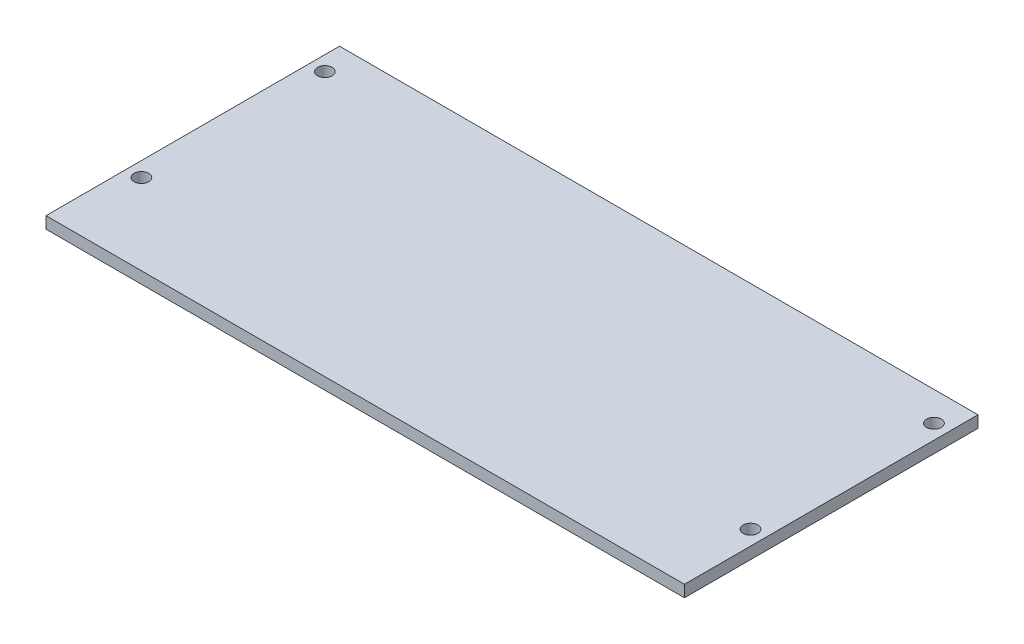
ISO-10303-21;
HEADER;
FILE_DESCRIPTION(('STEP AP214'),'2;1');
FILE_NAME('part.step','',(''),(''),'','','');
FILE_SCHEMA(('AUTOMOTIVE_DESIGN { 1 0 10303 214 1 1 1 1 }'));
ENDSEC;
DATA;
#1=APPLICATION_CONTEXT('core data for automotive mechanical design processes');
#2=APPLICATION_PROTOCOL_DEFINITION('international standard','automotive_design',2000,#1);
#3=PRODUCT_CONTEXT('',#1,'mechanical');
#4=PRODUCT('Part','Part','',(#3));
#5=PRODUCT_RELATED_PRODUCT_CATEGORY('part','',(#4));
#6=PRODUCT_DEFINITION_FORMATION('','',#4);
#7=PRODUCT_DEFINITION_CONTEXT('part definition',#1,'design');
#8=PRODUCT_DEFINITION('design','',#6,#7);
#9=PRODUCT_DEFINITION_SHAPE('','',#8);
#10=(LENGTH_UNIT() NAMED_UNIT(*) SI_UNIT(.MILLI.,.METRE.));
#11=(NAMED_UNIT(*) PLANE_ANGLE_UNIT() SI_UNIT($,.RADIAN.));
#12=(NAMED_UNIT(*) SI_UNIT($,.STERADIAN.) SOLID_ANGLE_UNIT());
#13=UNCERTAINTY_MEASURE_WITH_UNIT(LENGTH_MEASURE(1.E-05),#10,'distance_accuracy_value','');
#14=(GEOMETRIC_REPRESENTATION_CONTEXT(3) GLOBAL_UNCERTAINTY_ASSIGNED_CONTEXT((#13)) GLOBAL_UNIT_ASSIGNED_CONTEXT((#10,
#11,#12)) REPRESENTATION_CONTEXT('',''));
#15=CARTESIAN_POINT('',(0.,0.,0.));
#16=DIRECTION('',(0.,0.,1.));
#17=DIRECTION('',(1.,0.,0.));
#18=AXIS2_PLACEMENT_3D('',#15,#16,#17);
#19=CARTESIAN_POINT('',(0.,1.6,0.));
#20=DIRECTION('',(1.,0.,0.));
#21=DIRECTION('',(0.,0.,-1.));
#22=AXIS2_PLACEMENT_3D('',#19,#20,#21);
#23=PLANE('',#22);
#24=DIRECTION('',(0.,0.,1.));
#25=VECTOR('',#24,1.);
#26=CARTESIAN_POINT('',(0.,0.,0.));
#27=LINE('',#26,#25);
#28=CARTESIAN_POINT('',(0.,0.,-40.));
#29=VERTEX_POINT('',#28);
#30=CARTESIAN_POINT('',(0.,0.,0.));
#31=VERTEX_POINT('',#30);
#32=EDGE_CURVE('E95',#29,#31,#27,.T.);
#33=ORIENTED_EDGE('',*,*,#32,.T.);
#34=DIRECTION('',(0.,-1.,0.));
#35=VECTOR('',#34,1.);
#36=CARTESIAN_POINT('',(0.,1.6,0.));
#37=LINE('',#36,#35);
#38=CARTESIAN_POINT('',(0.,1.6,0.));
#39=VERTEX_POINT('',#38);
#40=EDGE_CURVE('E11',#39,#31,#37,.T.);
#41=ORIENTED_EDGE('',*,*,#40,.F.);
#42=DIRECTION('',(0.,0.,1.));
#43=VECTOR('',#42,1.);
#44=CARTESIAN_POINT('',(0.,1.6,0.));
#45=LINE('',#44,#43);
#46=CARTESIAN_POINT('',(0.,1.6,-40.));
#47=VERTEX_POINT('',#46);
#48=EDGE_CURVE('E83',#47,#39,#45,.T.);
#49=ORIENTED_EDGE('',*,*,#48,.F.);
#50=DIRECTION('',(0.,-1.,0.));
#51=VECTOR('',#50,1.);
#52=CARTESIAN_POINT('',(0.,1.6,-40.));
#53=LINE('',#52,#51);
#54=EDGE_CURVE('E91',#47,#29,#53,.T.);
#55=ORIENTED_EDGE('',*,*,#54,.T.);
#56=EDGE_LOOP('',(#33,#41,#49,#55));
#57=FACE_BOUND('',#56,.T.);
#58=ADVANCED_FACE('F32',(#57),#23,.F.);
#59=CARTESIAN_POINT('',(0.,1.6,0.));
#60=DIRECTION('',(0.,0.,-1.));
#61=DIRECTION('',(-1.,0.,0.));
#62=AXIS2_PLACEMENT_3D('',#59,#60,#61);
#63=PLANE('',#62);
#64=DIRECTION('',(1.,0.,0.));
#65=VECTOR('',#64,1.);
#66=CARTESIAN_POINT('',(0.,0.,0.));
#67=LINE('',#66,#65);
#68=CARTESIAN_POINT('',(87.,0.,0.));
#69=VERTEX_POINT('',#68);
#70=EDGE_CURVE('E87',#31,#69,#67,.T.);
#71=ORIENTED_EDGE('',*,*,#70,.T.);
#72=DIRECTION('',(0.,-1.,0.));
#73=VECTOR('',#72,1.);
#74=CARTESIAN_POINT('',(87.,1.6,0.));
#75=LINE('',#74,#73);
#76=CARTESIAN_POINT('',(87.,1.6,0.));
#77=VERTEX_POINT('',#76);
#78=EDGE_CURVE('E40',#77,#69,#75,.T.);
#79=ORIENTED_EDGE('',*,*,#78,.F.);
#80=DIRECTION('',(1.,0.,0.));
#81=VECTOR('',#80,1.);
#82=CARTESIAN_POINT('',(0.,1.6,0.));
#83=LINE('',#82,#81);
#84=EDGE_CURVE('E78',#39,#77,#83,.T.);
#85=ORIENTED_EDGE('',*,*,#84,.F.);
#86=ORIENTED_EDGE('',*,*,#40,.T.);
#87=EDGE_LOOP('',(#71,#79,#85,#86));
#88=FACE_BOUND('',#87,.T.);
#89=ADVANCED_FACE('F86',(#88),#63,.F.);
#90=CARTESIAN_POINT('',(87.,1.6,0.));
#91=DIRECTION('',(-1.,0.,0.));
#92=DIRECTION('',(0.,0.,1.));
#93=AXIS2_PLACEMENT_3D('',#90,#91,#92);
#94=PLANE('',#93);
#95=DIRECTION('',(0.,0.,-1.));
#96=VECTOR('',#95,1.);
#97=CARTESIAN_POINT('',(87.,0.,0.));
#98=LINE('',#97,#96);
#99=CARTESIAN_POINT('',(87.,0.,-40.));
#100=VERTEX_POINT('',#99);
#101=EDGE_CURVE('E65',#69,#100,#98,.T.);
#102=ORIENTED_EDGE('',*,*,#101,.T.);
#103=DIRECTION('',(0.,-1.,0.));
#104=VECTOR('',#103,1.);
#105=CARTESIAN_POINT('',(87.,1.6,-40.));
#106=LINE('',#105,#104);
#107=CARTESIAN_POINT('',(87.,1.6,-40.));
#108=VERTEX_POINT('',#107);
#109=EDGE_CURVE('E88',#108,#100,#106,.T.);
#110=ORIENTED_EDGE('',*,*,#109,.F.);
#111=DIRECTION('',(0.,0.,-1.));
#112=VECTOR('',#111,1.);
#113=CARTESIAN_POINT('',(87.,1.6,0.));
#114=LINE('',#113,#112);
#115=EDGE_CURVE('E81',#77,#108,#114,.T.);
#116=ORIENTED_EDGE('',*,*,#115,.F.);
#117=ORIENTED_EDGE('',*,*,#78,.T.);
#118=EDGE_LOOP('',(#102,#110,#116,#117));
#119=FACE_BOUND('',#118,.T.);
#120=ADVANCED_FACE('F89',(#119),#94,.F.);
#121=CARTESIAN_POINT('',(0.,1.6,-40.));
#122=DIRECTION('',(0.,0.,1.));
#123=DIRECTION('',(1.,0.,0.));
#124=AXIS2_PLACEMENT_3D('',#121,#122,#123);
#125=PLANE('',#124);
#126=DIRECTION('',(-1.,0.,0.));
#127=VECTOR('',#126,1.);
#128=CARTESIAN_POINT('',(0.,0.,-40.));
#129=LINE('',#128,#127);
#130=EDGE_CURVE('E71',#100,#29,#129,.T.);
#131=ORIENTED_EDGE('',*,*,#130,.T.);
#132=ORIENTED_EDGE('',*,*,#54,.F.);
#133=DIRECTION('',(-1.,0.,0.));
#134=VECTOR('',#133,1.);
#135=CARTESIAN_POINT('',(0.,1.6,-40.));
#136=LINE('',#135,#134);
#137=EDGE_CURVE('E48',#108,#47,#136,.T.);
#138=ORIENTED_EDGE('',*,*,#137,.F.);
#139=ORIENTED_EDGE('',*,*,#109,.T.);
#140=EDGE_LOOP('',(#131,#132,#138,#139));
#141=FACE_BOUND('',#140,.T.);
#142=ADVANCED_FACE('F103',(#141),#125,.F.);
#143=CARTESIAN_POINT('',(0.,1.6,0.));
#144=DIRECTION('',(0.,-1.,0.));
#145=DIRECTION('',(0.,0.,-1.));
#146=AXIS2_PLACEMENT_3D('',#143,#144,#145);
#147=PLANE('',#146);
#148=CARTESIAN_POINT('',(85.,1.6,-11.));
#149=DIRECTION('',(0.,1.,0.));
#150=DIRECTION('',(0.,0.,1.));
#151=AXIS2_PLACEMENT_3D('',#148,#149,#150);
#152=CIRCLE('',#151,0.999999999999998);
#153=CARTESIAN_POINT('',(85.,1.6,-10.));
#154=VERTEX_POINT('',#153);
#155=EDGE_CURVE('E127',#154,#154,#152,.T.);
#156=ORIENTED_EDGE('',*,*,#155,.F.);
#157=EDGE_LOOP('',(#156));
#158=FACE_BOUND('',#157,.T.);
#159=CARTESIAN_POINT('',(85.,1.6,-36.));
#160=DIRECTION('',(0.,1.,0.));
#161=DIRECTION('',(0.,0.,1.));
#162=AXIS2_PLACEMENT_3D('',#159,#160,#161);
#163=CIRCLE('',#162,0.999999999999998);
#164=CARTESIAN_POINT('',(85.,1.6,-35.));
#165=VERTEX_POINT('',#164);
#166=EDGE_CURVE('E121',#165,#165,#163,.T.);
#167=ORIENTED_EDGE('',*,*,#166,.F.);
#168=EDGE_LOOP('',(#167));
#169=FACE_BOUND('',#168,.T.);
#170=CARTESIAN_POINT('',(2.,1.6,-36.));
#171=DIRECTION('',(0.,1.,0.));
#172=DIRECTION('',(0.,0.,1.));
#173=AXIS2_PLACEMENT_3D('',#170,#171,#172);
#174=CIRCLE('',#173,1.);
#175=CARTESIAN_POINT('',(2.,1.6,-35.));
#176=VERTEX_POINT('',#175);
#177=EDGE_CURVE('E115',#176,#176,#174,.T.);
#178=ORIENTED_EDGE('',*,*,#177,.F.);
#179=EDGE_LOOP('',(#178));
#180=FACE_BOUND('',#179,.T.);
#181=CARTESIAN_POINT('',(2.,1.6,-11.));
#182=DIRECTION('',(0.,1.,0.));
#183=DIRECTION('',(0.,0.,1.));
#184=AXIS2_PLACEMENT_3D('',#181,#182,#183);
#185=CIRCLE('',#184,1.);
#186=CARTESIAN_POINT('',(2.,1.6,-10.));
#187=VERTEX_POINT('',#186);
#188=EDGE_CURVE('E109',#187,#187,#185,.T.);
#189=ORIENTED_EDGE('',*,*,#188,.F.);
#190=EDGE_LOOP('',(#189));
#191=FACE_BOUND('',#190,.T.);
#192=ORIENTED_EDGE('',*,*,#48,.T.);
#193=ORIENTED_EDGE('',*,*,#84,.T.);
#194=ORIENTED_EDGE('',*,*,#115,.T.);
#195=ORIENTED_EDGE('',*,*,#137,.T.);
#196=EDGE_LOOP('',(#192,#193,#194,#195));
#197=FACE_BOUND('',#196,.T.);
#198=ADVANCED_FACE('F79',(#158,#169,#180,#191,#197),#147,.F.);
#199=CARTESIAN_POINT('',(0.,0.,0.));
#200=DIRECTION('',(0.,-1.,0.));
#201=DIRECTION('',(0.,0.,-1.));
#202=AXIS2_PLACEMENT_3D('',#199,#200,#201);
#203=PLANE('',#202);
#204=CARTESIAN_POINT('',(85.,0.,-11.));
#205=DIRECTION('',(0.,1.,0.));
#206=DIRECTION('',(0.,0.,1.));
#207=AXIS2_PLACEMENT_3D('',#204,#205,#206);
#208=CIRCLE('',#207,0.999999999999998);
#209=CARTESIAN_POINT('',(85.,0.,-10.));
#210=VERTEX_POINT('',#209);
#211=EDGE_CURVE('E124',#210,#210,#208,.T.);
#212=ORIENTED_EDGE('',*,*,#211,.T.);
#213=EDGE_LOOP('',(#212));
#214=FACE_BOUND('',#213,.T.);
#215=CARTESIAN_POINT('',(85.,0.,-36.));
#216=DIRECTION('',(0.,1.,0.));
#217=DIRECTION('',(0.,0.,1.));
#218=AXIS2_PLACEMENT_3D('',#215,#216,#217);
#219=CIRCLE('',#218,0.999999999999998);
#220=CARTESIAN_POINT('',(85.,0.,-35.));
#221=VERTEX_POINT('',#220);
#222=EDGE_CURVE('E118',#221,#221,#219,.T.);
#223=ORIENTED_EDGE('',*,*,#222,.T.);
#224=EDGE_LOOP('',(#223));
#225=FACE_BOUND('',#224,.T.);
#226=CARTESIAN_POINT('',(2.,0.,-36.));
#227=DIRECTION('',(0.,1.,0.));
#228=DIRECTION('',(0.,0.,1.));
#229=AXIS2_PLACEMENT_3D('',#226,#227,#228);
#230=CIRCLE('',#229,1.);
#231=CARTESIAN_POINT('',(2.,0.,-35.));
#232=VERTEX_POINT('',#231);
#233=EDGE_CURVE('E112',#232,#232,#230,.T.);
#234=ORIENTED_EDGE('',*,*,#233,.T.);
#235=EDGE_LOOP('',(#234));
#236=FACE_BOUND('',#235,.T.);
#237=CARTESIAN_POINT('',(2.,0.,-11.));
#238=DIRECTION('',(0.,1.,0.));
#239=DIRECTION('',(0.,0.,1.));
#240=AXIS2_PLACEMENT_3D('',#237,#238,#239);
#241=CIRCLE('',#240,1.);
#242=CARTESIAN_POINT('',(2.,0.,-10.));
#243=VERTEX_POINT('',#242);
#244=EDGE_CURVE('E98',#243,#243,#241,.T.);
#245=ORIENTED_EDGE('',*,*,#244,.T.);
#246=EDGE_LOOP('',(#245));
#247=FACE_BOUND('',#246,.T.);
#248=ORIENTED_EDGE('',*,*,#32,.F.);
#249=ORIENTED_EDGE('',*,*,#130,.F.);
#250=ORIENTED_EDGE('',*,*,#101,.F.);
#251=ORIENTED_EDGE('',*,*,#70,.F.);
#252=EDGE_LOOP('',(#248,#249,#250,#251));
#253=FACE_BOUND('',#252,.T.);
#254=ADVANCED_FACE('F106',(#214,#225,#236,#247,#253),#203,.T.);
#255=CARTESIAN_POINT('',(2.,0.,-11.));
#256=DIRECTION('',(0.,1.,0.));
#257=DIRECTION('',(0.,0.,1.));
#258=AXIS2_PLACEMENT_3D('',#255,#256,#257);
#259=CYLINDRICAL_SURFACE('',#258,1.);
#260=ORIENTED_EDGE('',*,*,#244,.F.);
#261=EDGE_LOOP('',(#260));
#262=FACE_BOUND('',#261,.T.);
#263=ORIENTED_EDGE('',*,*,#188,.T.);
#264=EDGE_LOOP('',(#263));
#265=FACE_BOUND('',#264,.T.);
#266=ADVANCED_FACE('F151',(#262,#265),#259,.F.);
#267=CARTESIAN_POINT('',(2.,0.,-36.));
#268=DIRECTION('',(0.,1.,0.));
#269=DIRECTION('',(0.,0.,1.));
#270=AXIS2_PLACEMENT_3D('',#267,#268,#269);
#271=CYLINDRICAL_SURFACE('',#270,1.);
#272=ORIENTED_EDGE('',*,*,#233,.F.);
#273=EDGE_LOOP('',(#272));
#274=FACE_BOUND('',#273,.T.);
#275=ORIENTED_EDGE('',*,*,#177,.T.);
#276=EDGE_LOOP('',(#275));
#277=FACE_BOUND('',#276,.T.);
#278=ADVANCED_FACE('F153',(#274,#277),#271,.F.);
#279=CARTESIAN_POINT('',(85.,0.,-36.));
#280=DIRECTION('',(0.,1.,0.));
#281=DIRECTION('',(0.,0.,1.));
#282=AXIS2_PLACEMENT_3D('',#279,#280,#281);
#283=CYLINDRICAL_SURFACE('',#282,0.999999999999998);
#284=ORIENTED_EDGE('',*,*,#222,.F.);
#285=EDGE_LOOP('',(#284));
#286=FACE_BOUND('',#285,.T.);
#287=ORIENTED_EDGE('',*,*,#166,.T.);
#288=EDGE_LOOP('',(#287));
#289=FACE_BOUND('',#288,.T.);
#290=ADVANCED_FACE('F138',(#286,#289),#283,.F.);
#291=CARTESIAN_POINT('',(85.,0.,-11.));
#292=DIRECTION('',(0.,1.,0.));
#293=DIRECTION('',(0.,0.,1.));
#294=AXIS2_PLACEMENT_3D('',#291,#292,#293);
#295=CYLINDRICAL_SURFACE('',#294,0.999999999999998);
#296=ORIENTED_EDGE('',*,*,#211,.F.);
#297=EDGE_LOOP('',(#296));
#298=FACE_BOUND('',#297,.T.);
#299=ORIENTED_EDGE('',*,*,#155,.T.);
#300=EDGE_LOOP('',(#299));
#301=FACE_BOUND('',#300,.T.);
#302=ADVANCED_FACE('F135',(#298,#301),#295,.F.);
#303=CLOSED_SHELL('',(#58,#89,#120,#142,#198,#254,#266,#278,#290,#302));
#304=MANIFOLD_SOLID_BREP('B2',#303);
#305=ADVANCED_BREP_SHAPE_REPRESENTATION('',(#18,#304),#14);
#306=SHAPE_DEFINITION_REPRESENTATION(#9,#305);
ENDSEC;
END-ISO-10303-21;
